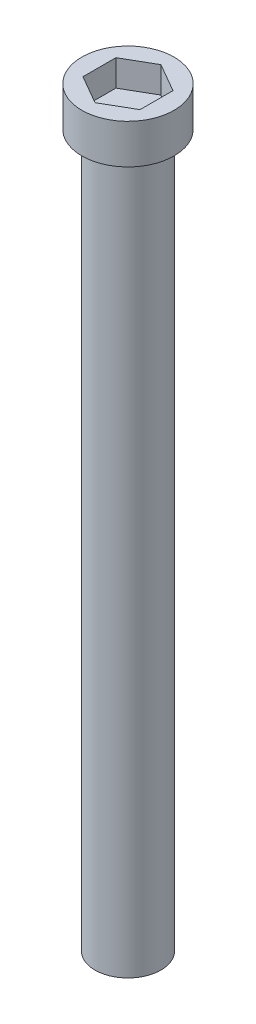
ISO-10303-21;
HEADER;
FILE_DESCRIPTION(('STEP AP214'),'2;1');
FILE_NAME('part.step','',(''),(''),'','','');
FILE_SCHEMA(('AUTOMOTIVE_DESIGN { 1 0 10303 214 1 1 1 1 }'));
ENDSEC;
DATA;
#1=APPLICATION_CONTEXT('core data for automotive mechanical design processes');
#2=APPLICATION_PROTOCOL_DEFINITION('international standard','automotive_design',2000,#1);
#3=PRODUCT_CONTEXT('',#1,'mechanical');
#4=PRODUCT('Part','Part','',(#3));
#5=PRODUCT_RELATED_PRODUCT_CATEGORY('part','',(#4));
#6=PRODUCT_DEFINITION_FORMATION('','',#4);
#7=PRODUCT_DEFINITION_CONTEXT('part definition',#1,'design');
#8=PRODUCT_DEFINITION('design','',#6,#7);
#9=PRODUCT_DEFINITION_SHAPE('','',#8);
#10=(LENGTH_UNIT() NAMED_UNIT(*) SI_UNIT(.MILLI.,.METRE.));
#11=(NAMED_UNIT(*) PLANE_ANGLE_UNIT() SI_UNIT($,.RADIAN.));
#12=(NAMED_UNIT(*) SI_UNIT($,.STERADIAN.) SOLID_ANGLE_UNIT());
#13=UNCERTAINTY_MEASURE_WITH_UNIT(LENGTH_MEASURE(1.E-05),#10,'distance_accuracy_value','');
#14=(GEOMETRIC_REPRESENTATION_CONTEXT(3) GLOBAL_UNCERTAINTY_ASSIGNED_CONTEXT((#13)) GLOBAL_UNIT_ASSIGNED_CONTEXT((#10,
#11,#12)) REPRESENTATION_CONTEXT('',''));
#15=CARTESIAN_POINT('',(0.,0.,0.));
#16=DIRECTION('',(0.,0.,1.));
#17=DIRECTION('',(1.,0.,0.));
#18=AXIS2_PLACEMENT_3D('',#15,#16,#17);
#19=CARTESIAN_POINT('',(0.,54.,0.));
#20=DIRECTION('',(0.,-1.,0.));
#21=DIRECTION('',(0.,0.,-1.));
#22=AXIS2_PLACEMENT_3D('',#19,#20,#21);
#23=CYLINDRICAL_SURFACE('',#22,2.5);
#24=CARTESIAN_POINT('',(0.,54.,0.));
#25=DIRECTION('',(0.,1.,0.));
#26=DIRECTION('',(0.,0.,1.));
#27=AXIS2_PLACEMENT_3D('',#24,#25,#26);
#28=CIRCLE('',#27,2.5);
#29=CARTESIAN_POINT('',(0.,54.,2.5));
#30=VERTEX_POINT('',#29);
#31=EDGE_CURVE('E11',#30,#30,#28,.T.);
#32=ORIENTED_EDGE('',*,*,#31,.F.);
#33=EDGE_LOOP('',(#32));
#34=FACE_BOUND('',#33,.T.);
#35=CARTESIAN_POINT('',(0.,0.,0.));
#36=DIRECTION('',(0.,1.,0.));
#37=DIRECTION('',(0.,0.,1.));
#38=AXIS2_PLACEMENT_3D('',#35,#36,#37);
#39=CIRCLE('',#38,2.5);
#40=CARTESIAN_POINT('',(0.,0.,2.5));
#41=VERTEX_POINT('',#40);
#42=EDGE_CURVE('E44',#41,#41,#39,.T.);
#43=ORIENTED_EDGE('',*,*,#42,.T.);
#44=EDGE_LOOP('',(#43));
#45=FACE_BOUND('',#44,.T.);
#46=ADVANCED_FACE('F41',(#34,#45),#23,.T.);
#47=CARTESIAN_POINT('',(0.,0.,0.));
#48=DIRECTION('',(0.,1.,0.));
#49=DIRECTION('',(0.,0.,1.));
#50=AXIS2_PLACEMENT_3D('',#47,#48,#49);
#51=PLANE('',#50);
#52=ORIENTED_EDGE('',*,*,#42,.F.);
#53=EDGE_LOOP('',(#52));
#54=FACE_BOUND('',#53,.T.);
#55=ADVANCED_FACE('F173',(#54),#51,.F.);
#56=CARTESIAN_POINT('',(0.,57.,0.));
#57=DIRECTION('',(0.,-1.,0.));
#58=DIRECTION('',(0.,0.,-1.));
#59=AXIS2_PLACEMENT_3D('',#56,#57,#58);
#60=CYLINDRICAL_SURFACE('',#59,3.5);
#61=CARTESIAN_POINT('',(0.,57.,0.));
#62=DIRECTION('',(0.,1.,0.));
#63=DIRECTION('',(0.,0.,1.));
#64=AXIS2_PLACEMENT_3D('',#61,#62,#63);
#65=CIRCLE('',#64,3.5);
#66=CARTESIAN_POINT('',(0.,57.,3.5));
#67=VERTEX_POINT('',#66);
#68=EDGE_CURVE('E148',#67,#67,#65,.T.);
#69=ORIENTED_EDGE('',*,*,#68,.F.);
#70=EDGE_LOOP('',(#69));
#71=FACE_BOUND('',#70,.T.);
#72=CARTESIAN_POINT('',(0.,54.,0.));
#73=DIRECTION('',(0.,1.,0.));
#74=DIRECTION('',(0.,0.,1.));
#75=AXIS2_PLACEMENT_3D('',#72,#73,#74);
#76=CIRCLE('',#75,3.5);
#77=CARTESIAN_POINT('',(0.,54.,3.5));
#78=VERTEX_POINT('',#77);
#79=EDGE_CURVE('E142',#78,#78,#76,.T.);
#80=ORIENTED_EDGE('',*,*,#79,.T.);
#81=EDGE_LOOP('',(#80));
#82=FACE_BOUND('',#81,.T.);
#83=ADVANCED_FACE('F154',(#71,#82),#60,.T.);
#84=CARTESIAN_POINT('',(0.,57.,0.));
#85=DIRECTION('',(0.,1.,0.));
#86=DIRECTION('',(0.,0.,1.));
#87=AXIS2_PLACEMENT_3D('',#84,#85,#86);
#88=PLANE('',#87);
#89=DIRECTION('',(-0.866025403784439,0.,-0.5));
#90=VECTOR('',#89,1.);
#91=CARTESIAN_POINT('',(2.1650635094611,57.,-1.25));
#92=LINE('',#91,#90);
#93=CARTESIAN_POINT('',(2.1650635094611,57.,-1.25));
#94=VERTEX_POINT('',#93);
#95=CARTESIAN_POINT('',(0.,57.,-2.5));
#96=VERTEX_POINT('',#95);
#97=EDGE_CURVE('E55',#94,#96,#92,.T.);
#98=ORIENTED_EDGE('',*,*,#97,.F.);
#99=DIRECTION('',(0.,0.,-1.));
#100=VECTOR('',#99,1.);
#101=CARTESIAN_POINT('',(2.1650635094611,57.,1.25));
#102=LINE('',#101,#100);
#103=CARTESIAN_POINT('',(2.1650635094611,57.,1.25));
#104=VERTEX_POINT('',#103);
#105=EDGE_CURVE('E138',#104,#94,#102,.T.);
#106=ORIENTED_EDGE('',*,*,#105,.F.);
#107=DIRECTION('',(0.866025403784439,0.,-0.5));
#108=VECTOR('',#107,1.);
#109=CARTESIAN_POINT('',(0.,57.,2.5));
#110=LINE('',#109,#108);
#111=CARTESIAN_POINT('',(0.,57.,2.5));
#112=VERTEX_POINT('',#111);
#113=EDGE_CURVE('E136',#112,#104,#110,.T.);
#114=ORIENTED_EDGE('',*,*,#113,.F.);
#115=DIRECTION('',(0.866025403784439,0.,0.5));
#116=VECTOR('',#115,1.);
#117=CARTESIAN_POINT('',(-2.1650635094611,57.,1.25));
#118=LINE('',#117,#116);
#119=CARTESIAN_POINT('',(-2.1650635094611,57.,1.25));
#120=VERTEX_POINT('',#119);
#121=EDGE_CURVE('E103',#120,#112,#118,.T.);
#122=ORIENTED_EDGE('',*,*,#121,.F.);
#123=DIRECTION('',(0.,0.,1.));
#124=VECTOR('',#123,1.);
#125=CARTESIAN_POINT('',(-2.1650635094611,57.,-1.25));
#126=LINE('',#125,#124);
#127=CARTESIAN_POINT('',(-2.1650635094611,57.,-1.25));
#128=VERTEX_POINT('',#127);
#129=EDGE_CURVE('E132',#128,#120,#126,.T.);
#130=ORIENTED_EDGE('',*,*,#129,.F.);
#131=DIRECTION('',(-0.866025403784439,0.,0.5));
#132=VECTOR('',#131,1.);
#133=CARTESIAN_POINT('',(0.,57.,-2.5));
#134=LINE('',#133,#132);
#135=EDGE_CURVE('E129',#96,#128,#134,.T.);
#136=ORIENTED_EDGE('',*,*,#135,.F.);
#137=EDGE_LOOP('',(#98,#106,#114,#122,#130,#136));
#138=FACE_BOUND('',#137,.T.);
#139=ORIENTED_EDGE('',*,*,#68,.T.);
#140=EDGE_LOOP('',(#139));
#141=FACE_BOUND('',#140,.T.);
#142=ADVANCED_FACE('F159',(#138,#141),#88,.T.);
#143=CARTESIAN_POINT('',(0.,54.,0.));
#144=DIRECTION('',(0.,1.,0.));
#145=DIRECTION('',(0.,0.,1.));
#146=AXIS2_PLACEMENT_3D('',#143,#144,#145);
#147=PLANE('',#146);
#148=ORIENTED_EDGE('',*,*,#31,.T.);
#149=EDGE_LOOP('',(#148));
#150=FACE_BOUND('',#149,.T.);
#151=ORIENTED_EDGE('',*,*,#79,.F.);
#152=EDGE_LOOP('',(#151));
#153=FACE_BOUND('',#152,.T.);
#154=ADVANCED_FACE('F156',(#150,#153),#147,.F.);
#155=CARTESIAN_POINT('',(2.1650635094611,55.,-1.25));
#156=DIRECTION('',(0.5,0.,-0.866025403784439));
#157=DIRECTION('',(-0.866025403784439,0.,-0.5));
#158=AXIS2_PLACEMENT_3D('',#155,#156,#157);
#159=PLANE('',#158);
#160=ORIENTED_EDGE('',*,*,#97,.T.);
#161=DIRECTION('',(0.,1.,0.));
#162=VECTOR('',#161,1.);
#163=CARTESIAN_POINT('',(0.,55.,-2.5));
#164=LINE('',#163,#162);
#165=CARTESIAN_POINT('',(0.,55.,-2.5));
#166=VERTEX_POINT('',#165);
#167=EDGE_CURVE('E85',#166,#96,#164,.T.);
#168=ORIENTED_EDGE('',*,*,#167,.F.);
#169=DIRECTION('',(-0.866025403784439,0.,-0.5));
#170=VECTOR('',#169,1.);
#171=CARTESIAN_POINT('',(2.1650635094611,55.,-1.25));
#172=LINE('',#171,#170);
#173=CARTESIAN_POINT('',(2.1650635094611,55.,-1.25));
#174=VERTEX_POINT('',#173);
#175=EDGE_CURVE('E140',#174,#166,#172,.T.);
#176=ORIENTED_EDGE('',*,*,#175,.F.);
#177=DIRECTION('',(0.,1.,0.));
#178=VECTOR('',#177,1.);
#179=CARTESIAN_POINT('',(2.1650635094611,55.,-1.25));
#180=LINE('',#179,#178);
#181=EDGE_CURVE('E63',#174,#94,#180,.T.);
#182=ORIENTED_EDGE('',*,*,#181,.T.);
#183=EDGE_LOOP('',(#160,#168,#176,#182));
#184=FACE_BOUND('',#183,.T.);
#185=ADVANCED_FACE('F158',(#184),#159,.F.);
#186=CARTESIAN_POINT('',(2.1650635094611,55.,1.25));
#187=DIRECTION('',(1.,0.,0.));
#188=DIRECTION('',(0.,0.,-1.));
#189=AXIS2_PLACEMENT_3D('',#186,#187,#188);
#190=PLANE('',#189);
#191=ORIENTED_EDGE('',*,*,#105,.T.);
#192=ORIENTED_EDGE('',*,*,#181,.F.);
#193=DIRECTION('',(0.,0.,-1.));
#194=VECTOR('',#193,1.);
#195=CARTESIAN_POINT('',(2.1650635094611,55.,1.25));
#196=LINE('',#195,#194);
#197=CARTESIAN_POINT('',(2.1650635094611,55.,1.25));
#198=VERTEX_POINT('',#197);
#199=EDGE_CURVE('E115',#198,#174,#196,.T.);
#200=ORIENTED_EDGE('',*,*,#199,.F.);
#201=DIRECTION('',(0.,1.,0.));
#202=VECTOR('',#201,1.);
#203=CARTESIAN_POINT('',(2.1650635094611,55.,1.25));
#204=LINE('',#203,#202);
#205=EDGE_CURVE('E107',#198,#104,#204,.T.);
#206=ORIENTED_EDGE('',*,*,#205,.T.);
#207=EDGE_LOOP('',(#191,#192,#200,#206));
#208=FACE_BOUND('',#207,.T.);
#209=ADVANCED_FACE('F167',(#208),#190,.F.);
#210=CARTESIAN_POINT('',(0.,55.,2.5));
#211=DIRECTION('',(0.5,0.,0.866025403784439));
#212=DIRECTION('',(0.866025403784439,0.,-0.5));
#213=AXIS2_PLACEMENT_3D('',#210,#211,#212);
#214=PLANE('',#213);
#215=ORIENTED_EDGE('',*,*,#113,.T.);
#216=ORIENTED_EDGE('',*,*,#205,.F.);
#217=DIRECTION('',(0.866025403784439,0.,-0.5));
#218=VECTOR('',#217,1.);
#219=CARTESIAN_POINT('',(0.,55.,2.5));
#220=LINE('',#219,#218);
#221=CARTESIAN_POINT('',(0.,55.,2.5));
#222=VERTEX_POINT('',#221);
#223=EDGE_CURVE('E111',#222,#198,#220,.T.);
#224=ORIENTED_EDGE('',*,*,#223,.F.);
#225=DIRECTION('',(0.,1.,0.));
#226=VECTOR('',#225,1.);
#227=CARTESIAN_POINT('',(0.,55.,2.5));
#228=LINE('',#227,#226);
#229=EDGE_CURVE('E96',#222,#112,#228,.T.);
#230=ORIENTED_EDGE('',*,*,#229,.T.);
#231=EDGE_LOOP('',(#215,#216,#224,#230));
#232=FACE_BOUND('',#231,.T.);
#233=ADVANCED_FACE('F112',(#232),#214,.F.);
#234=CARTESIAN_POINT('',(-2.1650635094611,55.,1.25));
#235=DIRECTION('',(-0.5,0.,0.866025403784439));
#236=DIRECTION('',(0.866025403784439,0.,0.5));
#237=AXIS2_PLACEMENT_3D('',#234,#235,#236);
#238=PLANE('',#237);
#239=ORIENTED_EDGE('',*,*,#121,.T.);
#240=ORIENTED_EDGE('',*,*,#229,.F.);
#241=DIRECTION('',(0.866025403784439,0.,0.5));
#242=VECTOR('',#241,1.);
#243=CARTESIAN_POINT('',(-2.1650635094611,55.,1.25));
#244=LINE('',#243,#242);
#245=CARTESIAN_POINT('',(-2.1650635094611,55.,1.25));
#246=VERTEX_POINT('',#245);
#247=EDGE_CURVE('E100',#246,#222,#244,.T.);
#248=ORIENTED_EDGE('',*,*,#247,.F.);
#249=DIRECTION('',(0.,1.,0.));
#250=VECTOR('',#249,1.);
#251=CARTESIAN_POINT('',(-2.1650635094611,55.,1.25));
#252=LINE('',#251,#250);
#253=EDGE_CURVE('E108',#246,#120,#252,.T.);
#254=ORIENTED_EDGE('',*,*,#253,.T.);
#255=EDGE_LOOP('',(#239,#240,#248,#254));
#256=FACE_BOUND('',#255,.T.);
#257=ADVANCED_FACE('F98',(#256),#238,.F.);
#258=CARTESIAN_POINT('',(-2.1650635094611,55.,-1.25));
#259=DIRECTION('',(-1.,0.,0.));
#260=DIRECTION('',(0.,0.,1.));
#261=AXIS2_PLACEMENT_3D('',#258,#259,#260);
#262=PLANE('',#261);
#263=ORIENTED_EDGE('',*,*,#129,.T.);
#264=ORIENTED_EDGE('',*,*,#253,.F.);
#265=DIRECTION('',(0.,0.,1.));
#266=VECTOR('',#265,1.);
#267=CARTESIAN_POINT('',(-2.1650635094611,55.,-1.25));
#268=LINE('',#267,#266);
#269=CARTESIAN_POINT('',(-2.1650635094611,55.,-1.25));
#270=VERTEX_POINT('',#269);
#271=EDGE_CURVE('E121',#270,#246,#268,.T.);
#272=ORIENTED_EDGE('',*,*,#271,.F.);
#273=DIRECTION('',(0.,1.,0.));
#274=VECTOR('',#273,1.);
#275=CARTESIAN_POINT('',(-2.1650635094611,55.,-1.25));
#276=LINE('',#275,#274);
#277=EDGE_CURVE('E145',#270,#128,#276,.T.);
#278=ORIENTED_EDGE('',*,*,#277,.T.);
#279=EDGE_LOOP('',(#263,#264,#272,#278));
#280=FACE_BOUND('',#279,.T.);
#281=ADVANCED_FACE('F235',(#280),#262,.F.);
#282=CARTESIAN_POINT('',(0.,55.,-2.5));
#283=DIRECTION('',(-0.5,0.,-0.866025403784439));
#284=DIRECTION('',(-0.866025403784439,0.,0.5));
#285=AXIS2_PLACEMENT_3D('',#282,#283,#284);
#286=PLANE('',#285);
#287=ORIENTED_EDGE('',*,*,#135,.T.);
#288=ORIENTED_EDGE('',*,*,#277,.F.);
#289=DIRECTION('',(-0.866025403784439,0.,0.5));
#290=VECTOR('',#289,1.);
#291=CARTESIAN_POINT('',(0.,55.,-2.5));
#292=LINE('',#291,#290);
#293=EDGE_CURVE('E123',#166,#270,#292,.T.);
#294=ORIENTED_EDGE('',*,*,#293,.F.);
#295=ORIENTED_EDGE('',*,*,#167,.T.);
#296=EDGE_LOOP('',(#287,#288,#294,#295));
#297=FACE_BOUND('',#296,.T.);
#298=ADVANCED_FACE('F244',(#297),#286,.F.);
#299=CARTESIAN_POINT('',(0.,55.,0.));
#300=DIRECTION('',(0.,1.,0.));
#301=DIRECTION('',(0.,0.,1.));
#302=AXIS2_PLACEMENT_3D('',#299,#300,#301);
#303=PLANE('',#302);
#304=ORIENTED_EDGE('',*,*,#175,.T.);
#305=ORIENTED_EDGE('',*,*,#293,.T.);
#306=ORIENTED_EDGE('',*,*,#271,.T.);
#307=ORIENTED_EDGE('',*,*,#247,.T.);
#308=ORIENTED_EDGE('',*,*,#223,.T.);
#309=ORIENTED_EDGE('',*,*,#199,.T.);
#310=EDGE_LOOP('',(#304,#305,#306,#307,#308,#309));
#311=FACE_BOUND('',#310,.T.);
#312=ADVANCED_FACE('F118',(#311),#303,.T.);
#313=CLOSED_SHELL('',(#46,#55,#83,#142,#154,#185,#209,#233,#257,#281,#298,#312));
#314=MANIFOLD_SOLID_BREP('B2',#313);
#315=ADVANCED_BREP_SHAPE_REPRESENTATION('',(#18,#314),#14);
#316=SHAPE_DEFINITION_REPRESENTATION(#9,#315);
ENDSEC;
END-ISO-10303-21;
